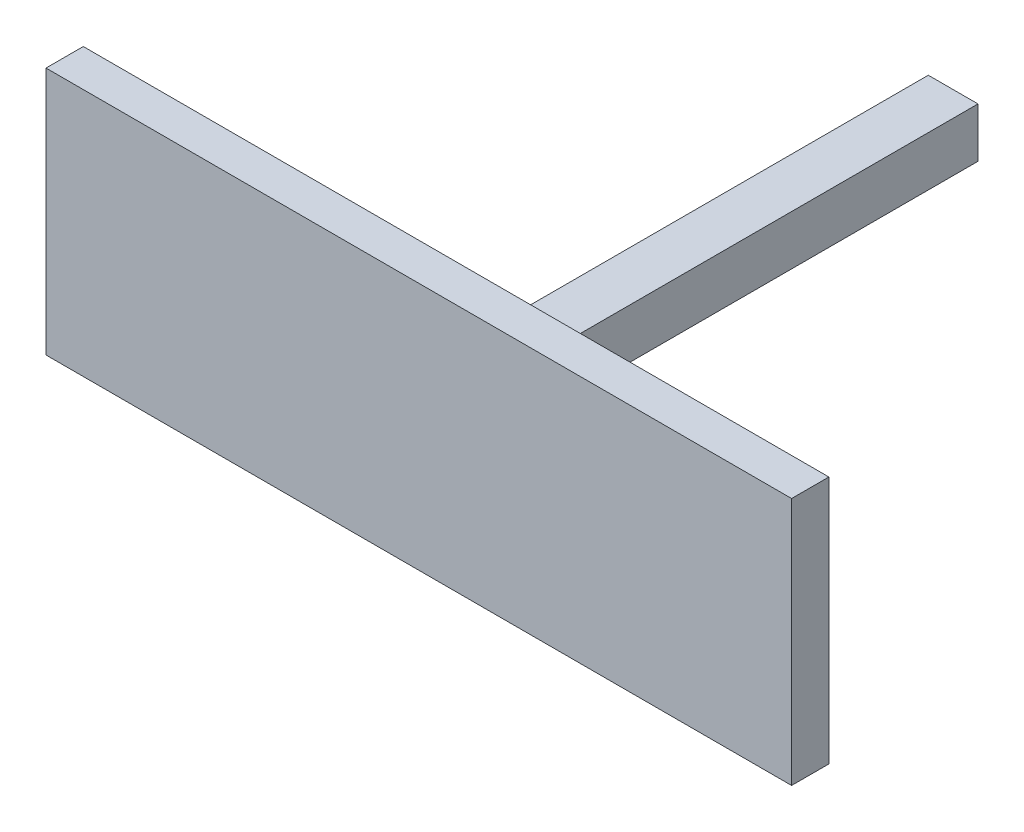
ISO-10303-21;
HEADER;
FILE_DESCRIPTION(('STEP AP214'),'2;1');
FILE_NAME('part.step','',(''),(''),'','','');
FILE_SCHEMA(('AUTOMOTIVE_DESIGN { 1 0 10303 214 1 1 1 1 }'));
ENDSEC;
DATA;
#1=APPLICATION_CONTEXT('core data for automotive mechanical design processes');
#2=APPLICATION_PROTOCOL_DEFINITION('international standard','automotive_design',2000,#1);
#3=PRODUCT_CONTEXT('',#1,'mechanical');
#4=PRODUCT('Part','Part','',(#3));
#5=PRODUCT_RELATED_PRODUCT_CATEGORY('part','',(#4));
#6=PRODUCT_DEFINITION_FORMATION('','',#4);
#7=PRODUCT_DEFINITION_CONTEXT('part definition',#1,'design');
#8=PRODUCT_DEFINITION('design','',#6,#7);
#9=PRODUCT_DEFINITION_SHAPE('','',#8);
#10=(LENGTH_UNIT() NAMED_UNIT(*) SI_UNIT(.MILLI.,.METRE.));
#11=(NAMED_UNIT(*) PLANE_ANGLE_UNIT() SI_UNIT($,.RADIAN.));
#12=(NAMED_UNIT(*) SI_UNIT($,.STERADIAN.) SOLID_ANGLE_UNIT());
#13=UNCERTAINTY_MEASURE_WITH_UNIT(LENGTH_MEASURE(1.E-05),#10,'distance_accuracy_value','');
#14=(GEOMETRIC_REPRESENTATION_CONTEXT(3) GLOBAL_UNCERTAINTY_ASSIGNED_CONTEXT((#13)) GLOBAL_UNIT_ASSIGNED_CONTEXT((#10,
#11,#12)) REPRESENTATION_CONTEXT('',''));
#15=CARTESIAN_POINT('',(0.,0.,0.));
#16=DIRECTION('',(0.,0.,1.));
#17=DIRECTION('',(1.,0.,0.));
#18=AXIS2_PLACEMENT_3D('',#15,#16,#17);
#19=CARTESIAN_POINT('',(0.,0.,0.));
#20=DIRECTION('',(0.,0.,-1.));
#21=DIRECTION('',(-1.,0.,0.));
#22=AXIS2_PLACEMENT_3D('',#19,#20,#21);
#23=PLANE('',#22);
#24=DIRECTION('',(0.,1.,0.));
#25=VECTOR('',#24,1.);
#26=CARTESIAN_POINT('',(30.,-10.,0.));
#27=LINE('',#26,#25);
#28=CARTESIAN_POINT('',(30.,-10.,0.));
#29=VERTEX_POINT('',#28);
#30=CARTESIAN_POINT('',(30.,10.,0.));
#31=VERTEX_POINT('',#30);
#32=EDGE_CURVE('E132',#29,#31,#27,.T.);
#33=ORIENTED_EDGE('',*,*,#32,.F.);
#34=DIRECTION('',(1.,0.,0.));
#35=VECTOR('',#34,1.);
#36=CARTESIAN_POINT('',(-30.,-10.,0.));
#37=LINE('',#36,#35);
#38=CARTESIAN_POINT('',(-30.,-10.,0.));
#39=VERTEX_POINT('',#38);
#40=EDGE_CURVE('E78',#39,#29,#37,.T.);
#41=ORIENTED_EDGE('',*,*,#40,.F.);
#42=DIRECTION('',(0.,-1.,0.));
#43=VECTOR('',#42,1.);
#44=CARTESIAN_POINT('',(-30.,-10.,0.));
#45=LINE('',#44,#43);
#46=CARTESIAN_POINT('',(-30.,10.,0.));
#47=VERTEX_POINT('',#46);
#48=EDGE_CURVE('E148',#47,#39,#45,.T.);
#49=ORIENTED_EDGE('',*,*,#48,.F.);
#50=DIRECTION('',(-1.,0.,0.));
#51=VECTOR('',#50,1.);
#52=CARTESIAN_POINT('',(-30.,10.,0.));
#53=LINE('',#52,#51);
#54=EDGE_CURVE('E135',#31,#47,#53,.T.);
#55=ORIENTED_EDGE('',*,*,#54,.F.);
#56=EDGE_LOOP('',(#33,#41,#49,#55));
#57=FACE_BOUND('',#56,.T.);
#58=DIRECTION('',(1.,0.,0.));
#59=VECTOR('',#58,1.);
#60=CARTESIAN_POINT('',(2.,2.,0.));
#61=LINE('',#60,#59);
#62=CARTESIAN_POINT('',(-2.,2.,0.));
#63=VERTEX_POINT('',#62);
#64=CARTESIAN_POINT('',(2.,2.,0.));
#65=VERTEX_POINT('',#64);
#66=EDGE_CURVE('E263',#63,#65,#61,.T.);
#67=ORIENTED_EDGE('',*,*,#66,.F.);
#68=DIRECTION('',(0.,1.,0.));
#69=VECTOR('',#68,1.);
#70=CARTESIAN_POINT('',(-2.,2.,0.));
#71=LINE('',#70,#69);
#72=CARTESIAN_POINT('',(-2.,-2.,0.));
#73=VERTEX_POINT('',#72);
#74=EDGE_CURVE('E130',#73,#63,#71,.T.);
#75=ORIENTED_EDGE('',*,*,#74,.F.);
#76=DIRECTION('',(-1.,0.,0.));
#77=VECTOR('',#76,1.);
#78=CARTESIAN_POINT('',(2.,-2.,0.));
#79=LINE('',#78,#77);
#80=CARTESIAN_POINT('',(2.,-2.,0.));
#81=VERTEX_POINT('',#80);
#82=EDGE_CURVE('E126',#81,#73,#79,.T.);
#83=ORIENTED_EDGE('',*,*,#82,.F.);
#84=DIRECTION('',(0.,-1.,0.));
#85=VECTOR('',#84,1.);
#86=CARTESIAN_POINT('',(2.,2.,0.));
#87=LINE('',#86,#85);
#88=EDGE_CURVE('E260',#65,#81,#87,.T.);
#89=ORIENTED_EDGE('',*,*,#88,.F.);
#90=EDGE_LOOP('',(#67,#75,#83,#89));
#91=FACE_BOUND('',#90,.T.);
#92=ADVANCED_FACE('F33',(#57,#91),#23,.T.);
#93=CARTESIAN_POINT('',(30.,-10.,3.));
#94=DIRECTION('',(-1.,0.,0.));
#95=DIRECTION('',(0.,0.,1.));
#96=AXIS2_PLACEMENT_3D('',#93,#94,#95);
#97=PLANE('',#96);
#98=ORIENTED_EDGE('',*,*,#32,.T.);
#99=DIRECTION('',(0.,0.,-1.));
#100=VECTOR('',#99,1.);
#101=CARTESIAN_POINT('',(30.,10.,3.));
#102=LINE('',#101,#100);
#103=CARTESIAN_POINT('',(30.,10.,3.));
#104=VERTEX_POINT('',#103);
#105=EDGE_CURVE('E11',#104,#31,#102,.T.);
#106=ORIENTED_EDGE('',*,*,#105,.F.);
#107=DIRECTION('',(0.,1.,0.));
#108=VECTOR('',#107,1.);
#109=CARTESIAN_POINT('',(30.,-10.,3.));
#110=LINE('',#109,#108);
#111=CARTESIAN_POINT('',(30.,-10.,3.));
#112=VERTEX_POINT('',#111);
#113=EDGE_CURVE('E140',#112,#104,#110,.T.);
#114=ORIENTED_EDGE('',*,*,#113,.F.);
#115=DIRECTION('',(0.,0.,-1.));
#116=VECTOR('',#115,1.);
#117=CARTESIAN_POINT('',(30.,-10.,3.));
#118=LINE('',#117,#116);
#119=EDGE_CURVE('E145',#112,#29,#118,.T.);
#120=ORIENTED_EDGE('',*,*,#119,.T.);
#121=EDGE_LOOP('',(#98,#106,#114,#120));
#122=FACE_BOUND('',#121,.T.);
#123=ADVANCED_FACE('F35',(#122),#97,.F.);
#124=CARTESIAN_POINT('',(-30.,10.,3.));
#125=DIRECTION('',(0.,-1.,0.));
#126=DIRECTION('',(0.,0.,-1.));
#127=AXIS2_PLACEMENT_3D('',#124,#125,#126);
#128=PLANE('',#127);
#129=ORIENTED_EDGE('',*,*,#54,.T.);
#130=DIRECTION('',(0.,0.,-1.));
#131=VECTOR('',#130,1.);
#132=CARTESIAN_POINT('',(-30.,10.,3.));
#133=LINE('',#132,#131);
#134=CARTESIAN_POINT('',(-30.,10.,3.));
#135=VERTEX_POINT('',#134);
#136=EDGE_CURVE('E41',#135,#47,#133,.T.);
#137=ORIENTED_EDGE('',*,*,#136,.F.);
#138=DIRECTION('',(-1.,0.,0.));
#139=VECTOR('',#138,1.);
#140=CARTESIAN_POINT('',(-30.,10.,3.));
#141=LINE('',#140,#139);
#142=EDGE_CURVE('E85',#104,#135,#141,.T.);
#143=ORIENTED_EDGE('',*,*,#142,.F.);
#144=ORIENTED_EDGE('',*,*,#105,.T.);
#145=EDGE_LOOP('',(#129,#137,#143,#144));
#146=FACE_BOUND('',#145,.T.);
#147=ADVANCED_FACE('F174',(#146),#128,.F.);
#148=CARTESIAN_POINT('',(-30.,-10.,3.));
#149=DIRECTION('',(1.,0.,0.));
#150=DIRECTION('',(0.,0.,-1.));
#151=AXIS2_PLACEMENT_3D('',#148,#149,#150);
#152=PLANE('',#151);
#153=ORIENTED_EDGE('',*,*,#48,.T.);
#154=DIRECTION('',(0.,0.,-1.));
#155=VECTOR('',#154,1.);
#156=CARTESIAN_POINT('',(-30.,-10.,3.));
#157=LINE('',#156,#155);
#158=CARTESIAN_POINT('',(-30.,-10.,3.));
#159=VERTEX_POINT('',#158);
#160=EDGE_CURVE('E152',#159,#39,#157,.T.);
#161=ORIENTED_EDGE('',*,*,#160,.F.);
#162=DIRECTION('',(0.,-1.,0.));
#163=VECTOR('',#162,1.);
#164=CARTESIAN_POINT('',(-30.,-10.,3.));
#165=LINE('',#164,#163);
#166=EDGE_CURVE('E143',#135,#159,#165,.T.);
#167=ORIENTED_EDGE('',*,*,#166,.F.);
#168=ORIENTED_EDGE('',*,*,#136,.T.);
#169=EDGE_LOOP('',(#153,#161,#167,#168));
#170=FACE_BOUND('',#169,.T.);
#171=ADVANCED_FACE('F157',(#170),#152,.F.);
#172=CARTESIAN_POINT('',(-30.,-10.,3.));
#173=DIRECTION('',(0.,1.,0.));
#174=DIRECTION('',(0.,0.,1.));
#175=AXIS2_PLACEMENT_3D('',#172,#173,#174);
#176=PLANE('',#175);
#177=ORIENTED_EDGE('',*,*,#40,.T.);
#178=ORIENTED_EDGE('',*,*,#119,.F.);
#179=DIRECTION('',(1.,0.,0.));
#180=VECTOR('',#179,1.);
#181=CARTESIAN_POINT('',(-30.,-10.,3.));
#182=LINE('',#181,#180);
#183=EDGE_CURVE('E57',#159,#112,#182,.T.);
#184=ORIENTED_EDGE('',*,*,#183,.F.);
#185=ORIENTED_EDGE('',*,*,#160,.T.);
#186=EDGE_LOOP('',(#177,#178,#184,#185));
#187=FACE_BOUND('',#186,.T.);
#188=ADVANCED_FACE('F165',(#187),#176,.F.);
#189=CARTESIAN_POINT('',(0.,0.,3.));
#190=DIRECTION('',(0.,0.,-1.));
#191=DIRECTION('',(-1.,0.,0.));
#192=AXIS2_PLACEMENT_3D('',#189,#190,#191);
#193=PLANE('',#192);
#194=ORIENTED_EDGE('',*,*,#113,.T.);
#195=ORIENTED_EDGE('',*,*,#142,.T.);
#196=ORIENTED_EDGE('',*,*,#166,.T.);
#197=ORIENTED_EDGE('',*,*,#183,.T.);
#198=EDGE_LOOP('',(#194,#195,#196,#197));
#199=FACE_BOUND('',#198,.T.);
#200=ADVANCED_FACE('F167',(#199),#193,.F.);
#201=CARTESIAN_POINT('',(-2.,2.,-40.));
#202=DIRECTION('',(1.,0.,0.));
#203=DIRECTION('',(0.,1.,0.));
#204=AXIS2_PLACEMENT_3D('',#201,#202,#203);
#205=PLANE('',#204);
#206=ORIENTED_EDGE('',*,*,#74,.T.);
#207=DIRECTION('',(0.,0.,1.));
#208=VECTOR('',#207,1.);
#209=CARTESIAN_POINT('',(-2.,2.,-40.));
#210=LINE('',#209,#208);
#211=CARTESIAN_POINT('',(-2.,2.,-40.));
#212=VERTEX_POINT('',#211);
#213=EDGE_CURVE('E111',#212,#63,#210,.T.);
#214=ORIENTED_EDGE('',*,*,#213,.F.);
#215=DIRECTION('',(0.,1.,0.));
#216=VECTOR('',#215,1.);
#217=CARTESIAN_POINT('',(-2.,2.,-40.));
#218=LINE('',#217,#216);
#219=CARTESIAN_POINT('',(-2.,-2.,-40.));
#220=VERTEX_POINT('',#219);
#221=EDGE_CURVE('E118',#220,#212,#218,.T.);
#222=ORIENTED_EDGE('',*,*,#221,.F.);
#223=DIRECTION('',(0.,0.,1.));
#224=VECTOR('',#223,1.);
#225=CARTESIAN_POINT('',(-2.,-2.,-40.));
#226=LINE('',#225,#224);
#227=EDGE_CURVE('E258',#220,#73,#226,.T.);
#228=ORIENTED_EDGE('',*,*,#227,.T.);
#229=EDGE_LOOP('',(#206,#214,#222,#228));
#230=FACE_BOUND('',#229,.T.);
#231=ADVANCED_FACE('F128',(#230),#205,.F.);
#232=CARTESIAN_POINT('',(2.,2.,-40.));
#233=DIRECTION('',(0.,-1.,0.));
#234=DIRECTION('',(0.,0.,-1.));
#235=AXIS2_PLACEMENT_3D('',#232,#233,#234);
#236=PLANE('',#235);
#237=ORIENTED_EDGE('',*,*,#66,.T.);
#238=DIRECTION('',(0.,0.,1.));
#239=VECTOR('',#238,1.);
#240=CARTESIAN_POINT('',(2.,2.,-40.));
#241=LINE('',#240,#239);
#242=CARTESIAN_POINT('',(2.,2.,-40.));
#243=VERTEX_POINT('',#242);
#244=EDGE_CURVE('E114',#243,#65,#241,.T.);
#245=ORIENTED_EDGE('',*,*,#244,.F.);
#246=DIRECTION('',(1.,0.,0.));
#247=VECTOR('',#246,1.);
#248=CARTESIAN_POINT('',(2.,2.,-40.));
#249=LINE('',#248,#247);
#250=EDGE_CURVE('E107',#212,#243,#249,.T.);
#251=ORIENTED_EDGE('',*,*,#250,.F.);
#252=ORIENTED_EDGE('',*,*,#213,.T.);
#253=EDGE_LOOP('',(#237,#245,#251,#252));
#254=FACE_BOUND('',#253,.T.);
#255=ADVANCED_FACE('F109',(#254),#236,.F.);
#256=CARTESIAN_POINT('',(2.,2.,-40.));
#257=DIRECTION('',(-1.,0.,0.));
#258=DIRECTION('',(0.,-1.,0.));
#259=AXIS2_PLACEMENT_3D('',#256,#257,#258);
#260=PLANE('',#259);
#261=ORIENTED_EDGE('',*,*,#88,.T.);
#262=DIRECTION('',(0.,0.,1.));
#263=VECTOR('',#262,1.);
#264=CARTESIAN_POINT('',(2.,-2.,-40.));
#265=LINE('',#264,#263);
#266=CARTESIAN_POINT('',(2.,-2.,-40.));
#267=VERTEX_POINT('',#266);
#268=EDGE_CURVE('E48',#267,#81,#265,.T.);
#269=ORIENTED_EDGE('',*,*,#268,.F.);
#270=DIRECTION('',(0.,-1.,0.));
#271=VECTOR('',#270,1.);
#272=CARTESIAN_POINT('',(2.,2.,-40.));
#273=LINE('',#272,#271);
#274=EDGE_CURVE('E117',#243,#267,#273,.T.);
#275=ORIENTED_EDGE('',*,*,#274,.F.);
#276=ORIENTED_EDGE('',*,*,#244,.T.);
#277=EDGE_LOOP('',(#261,#269,#275,#276));
#278=FACE_BOUND('',#277,.T.);
#279=ADVANCED_FACE('F186',(#278),#260,.F.);
#280=CARTESIAN_POINT('',(2.,-2.,-40.));
#281=DIRECTION('',(0.,1.,0.));
#282=DIRECTION('',(0.,0.,1.));
#283=AXIS2_PLACEMENT_3D('',#280,#281,#282);
#284=PLANE('',#283);
#285=ORIENTED_EDGE('',*,*,#82,.T.);
#286=ORIENTED_EDGE('',*,*,#227,.F.);
#287=DIRECTION('',(-1.,0.,0.));
#288=VECTOR('',#287,1.);
#289=CARTESIAN_POINT('',(2.,-2.,-40.));
#290=LINE('',#289,#288);
#291=EDGE_CURVE('E122',#267,#220,#290,.T.);
#292=ORIENTED_EDGE('',*,*,#291,.F.);
#293=ORIENTED_EDGE('',*,*,#268,.T.);
#294=EDGE_LOOP('',(#285,#286,#292,#293));
#295=FACE_BOUND('',#294,.T.);
#296=ADVANCED_FACE('F189',(#295),#284,.F.);
#297=CARTESIAN_POINT('',(0.,0.,-40.));
#298=DIRECTION('',(0.,0.,-1.));
#299=DIRECTION('',(-1.,0.,0.));
#300=AXIS2_PLACEMENT_3D('',#297,#298,#299);
#301=PLANE('',#300);
#302=ORIENTED_EDGE('',*,*,#221,.T.);
#303=ORIENTED_EDGE('',*,*,#250,.T.);
#304=ORIENTED_EDGE('',*,*,#274,.T.);
#305=ORIENTED_EDGE('',*,*,#291,.T.);
#306=EDGE_LOOP('',(#302,#303,#304,#305));
#307=FACE_BOUND('',#306,.T.);
#308=ADVANCED_FACE('F121',(#307),#301,.T.);
#309=CLOSED_SHELL('',(#92,#123,#147,#171,#188,#200,#231,#255,#279,#296,#308));
#310=MANIFOLD_SOLID_BREP('B2',#309);
#311=ADVANCED_BREP_SHAPE_REPRESENTATION('',(#18,#310),#14);
#312=SHAPE_DEFINITION_REPRESENTATION(#9,#311);
ENDSEC;
END-ISO-10303-21;
